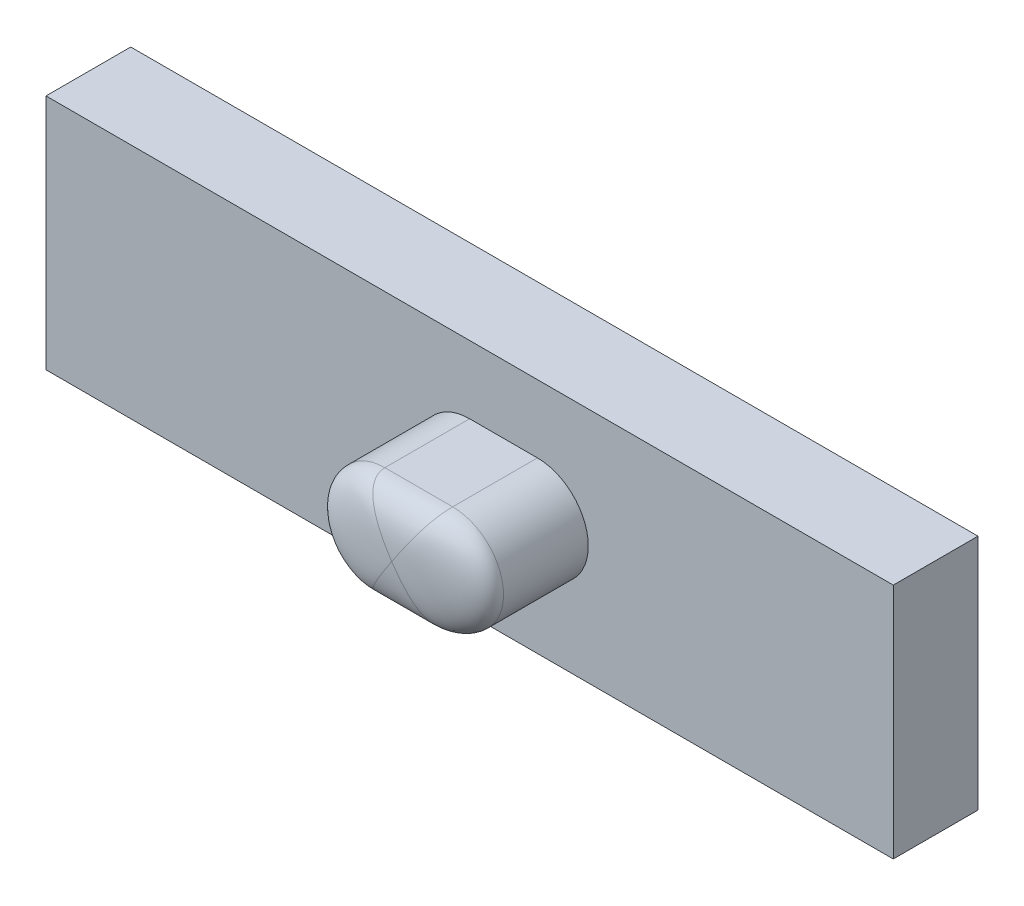
ISO-10303-21;
HEADER;
FILE_DESCRIPTION(('STEP AP214'),'2;1');
FILE_NAME('part.step','',(''),(''),'','','');
FILE_SCHEMA(('AUTOMOTIVE_DESIGN { 1 0 10303 214 1 1 1 1 }'));
ENDSEC;
DATA;
#1=APPLICATION_CONTEXT('core data for automotive mechanical design processes');
#2=APPLICATION_PROTOCOL_DEFINITION('international standard','automotive_design',2000,#1);
#3=PRODUCT_CONTEXT('',#1,'mechanical');
#4=PRODUCT('Part','Part','',(#3));
#5=PRODUCT_RELATED_PRODUCT_CATEGORY('part','',(#4));
#6=PRODUCT_DEFINITION_FORMATION('','',#4);
#7=PRODUCT_DEFINITION_CONTEXT('part definition',#1,'design');
#8=PRODUCT_DEFINITION('design','',#6,#7);
#9=PRODUCT_DEFINITION_SHAPE('','',#8);
#10=(LENGTH_UNIT() NAMED_UNIT(*) SI_UNIT(.MILLI.,.METRE.));
#11=(NAMED_UNIT(*) PLANE_ANGLE_UNIT() SI_UNIT($,.RADIAN.));
#12=(NAMED_UNIT(*) SI_UNIT($,.STERADIAN.) SOLID_ANGLE_UNIT());
#13=UNCERTAINTY_MEASURE_WITH_UNIT(LENGTH_MEASURE(1.E-05),#10,'distance_accuracy_value','');
#14=(GEOMETRIC_REPRESENTATION_CONTEXT(3) GLOBAL_UNCERTAINTY_ASSIGNED_CONTEXT((#13)) GLOBAL_UNIT_ASSIGNED_CONTEXT((#10,
#11,#12)) REPRESENTATION_CONTEXT('',''));
#15=CARTESIAN_POINT('',(0.,0.,0.));
#16=DIRECTION('',(0.,0.,1.));
#17=DIRECTION('',(1.,0.,0.));
#18=AXIS2_PLACEMENT_3D('',#15,#16,#17);
#19=CARTESIAN_POINT('',(0.,0.,0.));
#20=DIRECTION('',(0.,0.,-1.));
#21=DIRECTION('',(-1.,0.,0.));
#22=AXIS2_PLACEMENT_3D('',#19,#20,#21);
#23=PLANE('',#22);
#24=DIRECTION('',(1.,0.,0.));
#25=VECTOR('',#24,1.);
#26=CARTESIAN_POINT('',(-11.5,3.5,0.));
#27=LINE('',#26,#25);
#28=CARTESIAN_POINT('',(-13.5,3.5,0.));
#29=VERTEX_POINT('',#28);
#30=CARTESIAN_POINT('',(11.5,3.5,0.));
#31=VERTEX_POINT('',#30);
#32=EDGE_CURVE('E266',#29,#31,#27,.T.);
#33=ORIENTED_EDGE('',*,*,#32,.F.);
#34=DIRECTION('',(0.,1.,0.));
#35=VECTOR('',#34,1.);
#36=CARTESIAN_POINT('',(-13.5,-3.5,0.));
#37=LINE('',#36,#35);
#38=CARTESIAN_POINT('',(-13.5,-3.5,0.));
#39=VERTEX_POINT('',#38);
#40=EDGE_CURVE('E270',#39,#29,#37,.T.);
#41=ORIENTED_EDGE('',*,*,#40,.F.);
#42=DIRECTION('',(-1.,0.,0.));
#43=VECTOR('',#42,1.);
#44=CARTESIAN_POINT('',(-11.5,-3.50000000000001,0.));
#45=LINE('',#44,#43);
#46=CARTESIAN_POINT('',(11.5,-3.5,0.));
#47=VERTEX_POINT('',#46);
#48=EDGE_CURVE('E282',#47,#39,#45,.T.);
#49=ORIENTED_EDGE('',*,*,#48,.F.);
#50=DIRECTION('',(0.,-1.,0.));
#51=VECTOR('',#50,1.);
#52=CARTESIAN_POINT('',(11.5,3.5,0.));
#53=LINE('',#52,#51);
#54=EDGE_CURVE('E279',#31,#47,#53,.T.);
#55=ORIENTED_EDGE('',*,*,#54,.F.);
#56=EDGE_LOOP('',(#33,#41,#49,#55));
#57=FACE_BOUND('',#56,.T.);
#58=CARTESIAN_POINT('',(-1.,0.,0.));
#59=DIRECTION('',(0.,0.,1.));
#60=DIRECTION('',(1.,0.,0.));
#61=AXIS2_PLACEMENT_3D('',#58,#59,#60);
#62=CIRCLE('',#61,1.5);
#63=CARTESIAN_POINT('',(-1.,1.5,0.));
#64=VERTEX_POINT('',#63);
#65=CARTESIAN_POINT('',(-1.,-1.5,0.));
#66=VERTEX_POINT('',#65);
#67=EDGE_CURVE('E233',#64,#66,#62,.T.);
#68=ORIENTED_EDGE('',*,*,#67,.F.);
#69=DIRECTION('',(1.,0.,0.));
#70=VECTOR('',#69,1.);
#71=CARTESIAN_POINT('',(-1.,1.5,0.));
#72=LINE('',#71,#70);
#73=CARTESIAN_POINT('',(1.,1.5,0.));
#74=VERTEX_POINT('',#73);
#75=EDGE_CURVE('E240',#64,#74,#72,.T.);
#76=ORIENTED_EDGE('',*,*,#75,.T.);
#77=CARTESIAN_POINT('',(1.,0.,0.));
#78=DIRECTION('',(0.,0.,1.));
#79=DIRECTION('',(1.,0.,0.));
#80=AXIS2_PLACEMENT_3D('',#77,#78,#79);
#81=CIRCLE('',#80,1.5);
#82=CARTESIAN_POINT('',(1.,-1.5,0.));
#83=VERTEX_POINT('',#82);
#84=EDGE_CURVE('E253',#83,#74,#81,.T.);
#85=ORIENTED_EDGE('',*,*,#84,.F.);
#86=DIRECTION('',(1.,0.,0.));
#87=VECTOR('',#86,1.);
#88=CARTESIAN_POINT('',(-1.,-1.5,0.));
#89=LINE('',#88,#87);
#90=EDGE_CURVE('E251',#66,#83,#89,.T.);
#91=ORIENTED_EDGE('',*,*,#90,.F.);
#92=EDGE_LOOP('',(#68,#76,#85,#91));
#93=FACE_BOUND('',#92,.T.);
#94=ADVANCED_FACE('F35',(#57,#93),#23,.F.);
#95=CARTESIAN_POINT('',(-11.5,3.5,-2.5));
#96=DIRECTION('',(0.,-1.,0.));
#97=DIRECTION('',(1.,0.,0.));
#98=AXIS2_PLACEMENT_3D('',#95,#96,#97);
#99=PLANE('',#98);
#100=ORIENTED_EDGE('',*,*,#32,.T.);
#101=DIRECTION('',(0.,0.,1.));
#102=VECTOR('',#101,1.);
#103=CARTESIAN_POINT('',(11.5,3.5,-2.5));
#104=LINE('',#103,#102);
#105=CARTESIAN_POINT('',(11.5,3.5,-2.5));
#106=VERTEX_POINT('',#105);
#107=EDGE_CURVE('E294',#106,#31,#104,.T.);
#108=ORIENTED_EDGE('',*,*,#107,.F.);
#109=DIRECTION('',(1.,0.,0.));
#110=VECTOR('',#109,1.);
#111=CARTESIAN_POINT('',(-13.5,3.5,-2.5));
#112=LINE('',#111,#110);
#113=CARTESIAN_POINT('',(-13.5,3.5,-2.5));
#114=VERTEX_POINT('',#113);
#115=EDGE_CURVE('E267',#114,#106,#112,.T.);
#116=ORIENTED_EDGE('',*,*,#115,.F.);
#117=DIRECTION('',(0.,0.,1.));
#118=VECTOR('',#117,1.);
#119=CARTESIAN_POINT('',(-13.5,3.5,-2.5));
#120=LINE('',#119,#118);
#121=EDGE_CURVE('E277',#114,#29,#120,.T.);
#122=ORIENTED_EDGE('',*,*,#121,.T.);
#123=EDGE_LOOP('',(#100,#108,#116,#122));
#124=FACE_BOUND('',#123,.T.);
#125=ADVANCED_FACE('F37',(#124),#99,.F.);
#126=CARTESIAN_POINT('',(11.5,3.5,-2.5));
#127=DIRECTION('',(-1.,0.,0.));
#128=DIRECTION('',(0.,0.,1.));
#129=AXIS2_PLACEMENT_3D('',#126,#127,#128);
#130=PLANE('',#129);
#131=ORIENTED_EDGE('',*,*,#54,.T.);
#132=DIRECTION('',(0.,0.,1.));
#133=VECTOR('',#132,1.);
#134=CARTESIAN_POINT('',(11.5,-3.5,-2.5));
#135=LINE('',#134,#133);
#136=CARTESIAN_POINT('',(11.5,-3.5,-2.5));
#137=VERTEX_POINT('',#136);
#138=EDGE_CURVE('E291',#137,#47,#135,.T.);
#139=ORIENTED_EDGE('',*,*,#138,.F.);
#140=DIRECTION('',(0.,-1.,0.));
#141=VECTOR('',#140,1.);
#142=CARTESIAN_POINT('',(11.5,3.5,-2.5));
#143=LINE('',#142,#141);
#144=EDGE_CURVE('E269',#106,#137,#143,.T.);
#145=ORIENTED_EDGE('',*,*,#144,.F.);
#146=ORIENTED_EDGE('',*,*,#107,.T.);
#147=EDGE_LOOP('',(#131,#139,#145,#146));
#148=FACE_BOUND('',#147,.T.);
#149=ADVANCED_FACE('F343',(#148),#130,.F.);
#150=CARTESIAN_POINT('',(-11.5,-3.50000000000001,-2.5));
#151=DIRECTION('',(0.,1.,0.));
#152=DIRECTION('',(-1.,0.,0.));
#153=AXIS2_PLACEMENT_3D('',#150,#151,#152);
#154=PLANE('',#153);
#155=ORIENTED_EDGE('',*,*,#48,.T.);
#156=DIRECTION('',(0.,0.,1.));
#157=VECTOR('',#156,1.);
#158=CARTESIAN_POINT('',(-13.5,-3.5,-2.5));
#159=LINE('',#158,#157);
#160=CARTESIAN_POINT('',(-13.5,-3.5,-2.5));
#161=VERTEX_POINT('',#160);
#162=EDGE_CURVE('E288',#161,#39,#159,.T.);
#163=ORIENTED_EDGE('',*,*,#162,.F.);
#164=DIRECTION('',(1.,0.,0.));
#165=VECTOR('',#164,1.);
#166=CARTESIAN_POINT('',(-11.5,-3.50000000000001,-2.5));
#167=LINE('',#166,#165);
#168=EDGE_CURVE('E272',#161,#137,#167,.T.);
#169=ORIENTED_EDGE('',*,*,#168,.T.);
#170=ORIENTED_EDGE('',*,*,#138,.T.);
#171=EDGE_LOOP('',(#155,#163,#169,#170));
#172=FACE_BOUND('',#171,.T.);
#173=ADVANCED_FACE('F352',(#172),#154,.F.);
#174=CARTESIAN_POINT('',(-13.5,-3.5,-2.5));
#175=DIRECTION('',(1.,0.,0.));
#176=DIRECTION('',(0.,0.,-1.));
#177=AXIS2_PLACEMENT_3D('',#174,#175,#176);
#178=PLANE('',#177);
#179=ORIENTED_EDGE('',*,*,#40,.T.);
#180=ORIENTED_EDGE('',*,*,#121,.F.);
#181=DIRECTION('',(0.,1.,0.));
#182=VECTOR('',#181,1.);
#183=CARTESIAN_POINT('',(-13.5,-3.5,-2.5));
#184=LINE('',#183,#182);
#185=EDGE_CURVE('E275',#161,#114,#184,.T.);
#186=ORIENTED_EDGE('',*,*,#185,.F.);
#187=ORIENTED_EDGE('',*,*,#162,.T.);
#188=EDGE_LOOP('',(#179,#180,#186,#187));
#189=FACE_BOUND('',#188,.T.);
#190=ADVANCED_FACE('F349',(#189),#178,.F.);
#191=CARTESIAN_POINT('',(0.,0.,-2.5));
#192=DIRECTION('',(0.,0.,-1.));
#193=DIRECTION('',(-1.,0.,0.));
#194=AXIS2_PLACEMENT_3D('',#191,#192,#193);
#195=PLANE('',#194);
#196=DIRECTION('',(0.,1.,0.));
#197=VECTOR('',#196,1.);
#198=CARTESIAN_POINT('',(-4.19059892324151,-3.,-2.5));
#199=LINE('',#198,#197);
#200=CARTESIAN_POINT('',(-4.19059892324151,-3.,-2.5));
#201=VERTEX_POINT('',#200);
#202=CARTESIAN_POINT('',(-4.19059892324151,3.,-2.5));
#203=VERTEX_POINT('',#202);
#204=EDGE_CURVE('E203',#201,#203,#199,.T.);
#205=ORIENTED_EDGE('',*,*,#204,.F.);
#206=DIRECTION('',(1.,0.,0.));
#207=VECTOR('',#206,1.);
#208=CARTESIAN_POINT('',(0.,-3.,-2.5));
#209=LINE('',#208,#207);
#210=CARTESIAN_POINT('',(4.38675134594811,-3.,-2.5));
#211=VERTEX_POINT('',#210);
#212=EDGE_CURVE('E39',#201,#211,#209,.T.);
#213=ORIENTED_EDGE('',*,*,#212,.T.);
#214=DIRECTION('',(0.,-1.,0.));
#215=VECTOR('',#214,1.);
#216=CARTESIAN_POINT('',(4.38675134594811,0.,-2.5));
#217=LINE('',#216,#215);
#218=CARTESIAN_POINT('',(4.38675134594811,3.,-2.5));
#219=VERTEX_POINT('',#218);
#220=EDGE_CURVE('E300',#219,#211,#217,.T.);
#221=ORIENTED_EDGE('',*,*,#220,.F.);
#222=DIRECTION('',(1.,0.,0.));
#223=VECTOR('',#222,1.);
#224=CARTESIAN_POINT('',(0.,3.,-2.5));
#225=LINE('',#224,#223);
#226=EDGE_CURVE('E297',#203,#219,#225,.T.);
#227=ORIENTED_EDGE('',*,*,#226,.F.);
#228=EDGE_LOOP('',(#205,#213,#221,#227));
#229=FACE_BOUND('',#228,.T.);
#230=CARTESIAN_POINT('',(-11.5,-3.,-2.5));
#231=VERTEX_POINT('',#230);
#232=CARTESIAN_POINT('',(-5.19059892324151,-3.,-2.5));
#233=VERTEX_POINT('',#232);
#234=EDGE_CURVE('E11',#231,#233,#209,.T.);
#235=ORIENTED_EDGE('',*,*,#234,.T.);
#236=DIRECTION('',(0.,1.,0.));
#237=VECTOR('',#236,1.);
#238=CARTESIAN_POINT('',(-5.19059892324151,-3.,-2.5));
#239=LINE('',#238,#237);
#240=CARTESIAN_POINT('',(-5.19059892324151,3.,-2.5));
#241=VERTEX_POINT('',#240);
#242=EDGE_CURVE('E161',#233,#241,#239,.T.);
#243=ORIENTED_EDGE('',*,*,#242,.T.);
#244=CARTESIAN_POINT('',(-11.5,3.,-2.5));
#245=VERTEX_POINT('',#244);
#246=EDGE_CURVE('E299',#245,#241,#225,.T.);
#247=ORIENTED_EDGE('',*,*,#246,.F.);
#248=DIRECTION('',(0.,1.,0.));
#249=VECTOR('',#248,1.);
#250=CARTESIAN_POINT('',(-11.5,0.,-2.5));
#251=LINE('',#250,#249);
#252=EDGE_CURVE('E301',#231,#245,#251,.T.);
#253=ORIENTED_EDGE('',*,*,#252,.F.);
#254=EDGE_LOOP('',(#235,#243,#247,#253));
#255=FACE_BOUND('',#254,.T.);
#256=ORIENTED_EDGE('',*,*,#115,.T.);
#257=ORIENTED_EDGE('',*,*,#144,.T.);
#258=ORIENTED_EDGE('',*,*,#168,.F.);
#259=ORIENTED_EDGE('',*,*,#185,.T.);
#260=EDGE_LOOP('',(#256,#257,#258,#259));
#261=FACE_BOUND('',#260,.T.);
#262=ADVANCED_FACE('F309',(#229,#255,#261),#195,.T.);
#263=CARTESIAN_POINT('',(-1.,0.,2.5));
#264=DIRECTION('',(0.,0.,-1.));
#265=DIRECTION('',(-1.,0.,0.));
#266=AXIS2_PLACEMENT_3D('',#263,#264,#265);
#267=CYLINDRICAL_SURFACE('',#266,1.5);
#268=ORIENTED_EDGE('',*,*,#67,.T.);
#269=DIRECTION('',(0.,0.,-1.));
#270=VECTOR('',#269,1.);
#271=CARTESIAN_POINT('',(-1.,-1.5,2.5));
#272=LINE('',#271,#270);
#273=CARTESIAN_POINT('',(-1.,-1.5,2.5));
#274=VERTEX_POINT('',#273);
#275=EDGE_CURVE('E264',#274,#66,#272,.T.);
#276=ORIENTED_EDGE('',*,*,#275,.F.);
#277=CARTESIAN_POINT('',(-1.,0.,2.5));
#278=DIRECTION('',(0.,0.,1.));
#279=DIRECTION('',(1.,0.,0.));
#280=AXIS2_PLACEMENT_3D('',#277,#278,#279);
#281=CIRCLE('',#280,1.5);
#282=CARTESIAN_POINT('',(-1.,1.5,2.5));
#283=VERTEX_POINT('',#282);
#284=EDGE_CURVE('E234',#283,#274,#281,.T.);
#285=ORIENTED_EDGE('',*,*,#284,.F.);
#286=DIRECTION('',(0.,0.,-1.));
#287=VECTOR('',#286,1.);
#288=CARTESIAN_POINT('',(-1.,1.5,2.5));
#289=LINE('',#288,#287);
#290=EDGE_CURVE('E248',#283,#64,#289,.T.);
#291=ORIENTED_EDGE('',*,*,#290,.T.);
#292=EDGE_LOOP('',(#268,#276,#285,#291));
#293=FACE_BOUND('',#292,.T.);
#294=ADVANCED_FACE('F371',(#293),#267,.T.);
#295=CARTESIAN_POINT('',(-1.,-1.5,2.5));
#296=DIRECTION('',(0.,1.,0.));
#297=DIRECTION('',(0.,0.,1.));
#298=AXIS2_PLACEMENT_3D('',#295,#296,#297);
#299=PLANE('',#298);
#300=ORIENTED_EDGE('',*,*,#90,.T.);
#301=DIRECTION('',(0.,0.,-1.));
#302=VECTOR('',#301,1.);
#303=CARTESIAN_POINT('',(1.,-1.5,2.5));
#304=LINE('',#303,#302);
#305=CARTESIAN_POINT('',(1.,-1.5,2.5));
#306=VERTEX_POINT('',#305);
#307=EDGE_CURVE('E261',#306,#83,#304,.T.);
#308=ORIENTED_EDGE('',*,*,#307,.F.);
#309=DIRECTION('',(1.,0.,0.));
#310=VECTOR('',#309,1.);
#311=CARTESIAN_POINT('',(-1.,-1.5,2.5));
#312=LINE('',#311,#310);
#313=EDGE_CURVE('E239',#274,#306,#312,.T.);
#314=ORIENTED_EDGE('',*,*,#313,.F.);
#315=ORIENTED_EDGE('',*,*,#275,.T.);
#316=EDGE_LOOP('',(#300,#308,#314,#315));
#317=FACE_BOUND('',#316,.T.);
#318=ADVANCED_FACE('F375',(#317),#299,.F.);
#319=CARTESIAN_POINT('',(1.,0.,2.5));
#320=DIRECTION('',(0.,0.,-1.));
#321=DIRECTION('',(-1.,0.,0.));
#322=AXIS2_PLACEMENT_3D('',#319,#320,#321);
#323=CYLINDRICAL_SURFACE('',#322,1.5);
#324=ORIENTED_EDGE('',*,*,#84,.T.);
#325=DIRECTION('',(0.,0.,-1.));
#326=VECTOR('',#325,1.);
#327=CARTESIAN_POINT('',(1.,1.5,2.5));
#328=LINE('',#327,#326);
#329=CARTESIAN_POINT('',(1.,1.5,2.5));
#330=VERTEX_POINT('',#329);
#331=EDGE_CURVE('E258',#330,#74,#328,.T.);
#332=ORIENTED_EDGE('',*,*,#331,.F.);
#333=CARTESIAN_POINT('',(1.,0.,2.5));
#334=DIRECTION('',(0.,0.,1.));
#335=DIRECTION('',(1.,0.,0.));
#336=AXIS2_PLACEMENT_3D('',#333,#334,#335);
#337=CIRCLE('',#336,1.5);
#338=EDGE_CURVE('E242',#306,#330,#337,.T.);
#339=ORIENTED_EDGE('',*,*,#338,.F.);
#340=ORIENTED_EDGE('',*,*,#307,.T.);
#341=EDGE_LOOP('',(#324,#332,#339,#340));
#342=FACE_BOUND('',#341,.T.);
#343=ADVANCED_FACE('F380',(#342),#323,.T.);
#344=CARTESIAN_POINT('',(-1.,1.5,2.5));
#345=DIRECTION('',(0.,1.,0.));
#346=DIRECTION('',(0.,0.,1.));
#347=AXIS2_PLACEMENT_3D('',#344,#345,#346);
#348=PLANE('',#347);
#349=ORIENTED_EDGE('',*,*,#75,.F.);
#350=ORIENTED_EDGE('',*,*,#290,.F.);
#351=DIRECTION('',(1.,0.,0.));
#352=VECTOR('',#351,1.);
#353=CARTESIAN_POINT('',(-1.,1.5,2.5));
#354=LINE('',#353,#352);
#355=EDGE_CURVE('E245',#283,#330,#354,.T.);
#356=ORIENTED_EDGE('',*,*,#355,.T.);
#357=ORIENTED_EDGE('',*,*,#331,.T.);
#358=EDGE_LOOP('',(#349,#350,#356,#357));
#359=FACE_BOUND('',#358,.T.);
#360=ADVANCED_FACE('F386',(#359),#348,.T.);
#361=CARTESIAN_POINT('',(-1.,1.5,2.5));
#362=CARTESIAN_POINT('',(-1.,1.5,3.3));
#363=CARTESIAN_POINT('',(0.,0.,3.3));
#364=CARTESIAN_POINT('',(-4.,1.5,2.5));
#365=CARTESIAN_POINT('',(-4.,1.5,3.3));
#366=CARTESIAN_POINT('',(0.,0.,3.3));
#367=CARTESIAN_POINT('',(-4.,-1.5,2.5));
#368=CARTESIAN_POINT('',(-4.,-1.5,3.3));
#369=CARTESIAN_POINT('',(0.,0.,3.3));
#370=CARTESIAN_POINT('',(-1.,-1.5,2.5));
#371=CARTESIAN_POINT('',(-1.,-1.5,3.3));
#372=CARTESIAN_POINT('',(0.,0.,3.3));
#373=(BOUNDED_SURFACE() B_SPLINE_SURFACE(3,2,((#361,#362,#363),(#364,#365,#366),(#367,#368,
#369),(#370,#371,#372)),.UNSPECIFIED.,.F.,.F.,.F.) B_SPLINE_SURFACE_WITH_KNOTS((4,4),(3,3),(0.,
1.),(0.,1.),.UNSPECIFIED.) GEOMETRIC_REPRESENTATION_ITEM() RATIONAL_B_SPLINE_SURFACE(((1.,1.,
1.),(0.333333333333333,0.333333333333333,0.333333333333333),(0.333333333333333,
0.333333333333333,0.333333333333333),(1.,1.,1.))) REPRESENTATION_ITEM('') SURFACE());
#374=CARTESIAN_POINT('',(-1.,-1.5,2.5));
#375=CARTESIAN_POINT('',(-1.,-1.5,3.3));
#376=CARTESIAN_POINT('',(0.,0.,3.3));
#377=(BOUNDED_CURVE() B_SPLINE_CURVE(2,(#374,#375,#376),.UNSPECIFIED.,.F.,
.F.) B_SPLINE_CURVE_WITH_KNOTS((3,3),(0.,1.),
.UNSPECIFIED.) CURVE() GEOMETRIC_REPRESENTATION_ITEM() RATIONAL_B_SPLINE_CURVE((1.,1.,1.)) REPRESENTATION_ITEM(''));
#378=CARTESIAN_POINT('',(0.,0.,3.3));
#379=VERTEX_POINT('',#378);
#380=EDGE_CURVE('E206',#274,#379,#377,.T.);
#381=CARTESIAN_POINT('',(-1.,1.5,2.5));
#382=CARTESIAN_POINT('',(-1.,1.5,3.3));
#383=CARTESIAN_POINT('',(0.,0.,3.3));
#384=(BOUNDED_CURVE() B_SPLINE_CURVE(2,(#381,#382,#383),.UNSPECIFIED.,.F.,
.F.) B_SPLINE_CURVE_WITH_KNOTS((3,3),(0.,1.),
.UNSPECIFIED.) CURVE() GEOMETRIC_REPRESENTATION_ITEM() RATIONAL_B_SPLINE_CURVE((1.,1.,1.)) REPRESENTATION_ITEM(''));
#385=EDGE_CURVE('E197',#379,#283,#384,.F.);
#386=ORIENTED_EDGE('',*,*,#284,.T.);
#387=ORIENTED_EDGE('',*,*,#380,.T.);
#388=ORIENTED_EDGE('',*,*,#385,.T.);
#389=EDGE_LOOP('',(#386,#387,#388));
#390=FACE_BOUND('',#389,.T.);
#391=ADVANCED_FACE('F390',(#390),#373,.T.);
#392=CARTESIAN_POINT('',(-1.,-1.5,2.5));
#393=CARTESIAN_POINT('',(-1.,-1.5,3.3));
#394=CARTESIAN_POINT('',(0.,0.,3.3));
#395=CARTESIAN_POINT('',(1.,-1.5,2.5));
#396=CARTESIAN_POINT('',(1.,-1.5,3.3));
#397=CARTESIAN_POINT('',(0.,0.,3.3));
#398=(BOUNDED_SURFACE() B_SPLINE_SURFACE(1,2,((#392,#393,#394),(#395,#396,#397)),.UNSPECIFIED.,
.F.,.F.,.F.) B_SPLINE_SURFACE_WITH_KNOTS((2,2),(3,3),(0.,1.),(0.,1.),
.UNSPECIFIED.) GEOMETRIC_REPRESENTATION_ITEM() RATIONAL_B_SPLINE_SURFACE(((1.,1.,1.),(1.,1.,1.))) REPRESENTATION_ITEM('') SURFACE());
#399=CARTESIAN_POINT('',(1.,-1.5,2.5));
#400=CARTESIAN_POINT('',(1.,-1.5,3.3));
#401=CARTESIAN_POINT('',(0.,0.,3.3));
#402=(BOUNDED_CURVE() B_SPLINE_CURVE(2,(#399,#400,#401),.UNSPECIFIED.,.F.,
.F.) B_SPLINE_CURVE_WITH_KNOTS((3,3),(0.,1.),
.UNSPECIFIED.) CURVE() GEOMETRIC_REPRESENTATION_ITEM() RATIONAL_B_SPLINE_CURVE((1.,1.,1.)) REPRESENTATION_ITEM(''));
#403=EDGE_CURVE('E211',#306,#379,#402,.T.);
#404=ORIENTED_EDGE('',*,*,#313,.T.);
#405=ORIENTED_EDGE('',*,*,#403,.T.);
#406=ORIENTED_EDGE('',*,*,#380,.F.);
#407=EDGE_LOOP('',(#404,#405,#406));
#408=FACE_BOUND('',#407,.T.);
#409=ADVANCED_FACE('F408',(#408),#398,.T.);
#410=CARTESIAN_POINT('',(1.,1.5,2.5));
#411=CARTESIAN_POINT('',(1.,1.5,3.3));
#412=CARTESIAN_POINT('',(0.,0.,3.3));
#413=CARTESIAN_POINT('',(-1.,1.5,2.5));
#414=CARTESIAN_POINT('',(-1.,1.5,3.3));
#415=CARTESIAN_POINT('',(0.,0.,3.3));
#416=(BOUNDED_SURFACE() B_SPLINE_SURFACE(1,2,((#410,#411,#412),(#413,#414,#415)),.UNSPECIFIED.,
.F.,.F.,.F.) B_SPLINE_SURFACE_WITH_KNOTS((2,2),(3,3),(0.,1.),(0.,1.),
.UNSPECIFIED.) GEOMETRIC_REPRESENTATION_ITEM() RATIONAL_B_SPLINE_SURFACE(((1.,1.,1.),(1.,1.,1.))) REPRESENTATION_ITEM('') SURFACE());
#417=CARTESIAN_POINT('',(1.,1.5,2.5));
#418=CARTESIAN_POINT('',(1.,1.5,3.3));
#419=CARTESIAN_POINT('',(0.,0.,3.3));
#420=(BOUNDED_CURVE() B_SPLINE_CURVE(2,(#417,#418,#419),.UNSPECIFIED.,.F.,
.F.) B_SPLINE_CURVE_WITH_KNOTS((3,3),(0.,1.),
.UNSPECIFIED.) CURVE() GEOMETRIC_REPRESENTATION_ITEM() RATIONAL_B_SPLINE_CURVE((1.,1.,1.)) REPRESENTATION_ITEM(''));
#421=EDGE_CURVE('E225',#330,#379,#420,.T.);
#422=ORIENTED_EDGE('',*,*,#355,.F.);
#423=ORIENTED_EDGE('',*,*,#385,.F.);
#424=ORIENTED_EDGE('',*,*,#421,.F.);
#425=EDGE_LOOP('',(#422,#423,#424));
#426=FACE_BOUND('',#425,.T.);
#427=ADVANCED_FACE('F397',(#426),#416,.T.);
#428=CARTESIAN_POINT('',(1.,-1.5,2.5));
#429=CARTESIAN_POINT('',(1.,-1.5,3.3));
#430=CARTESIAN_POINT('',(0.,0.,3.3));
#431=CARTESIAN_POINT('',(4.,-1.5,2.5));
#432=CARTESIAN_POINT('',(4.,-1.5,3.3));
#433=CARTESIAN_POINT('',(0.,0.,3.3));
#434=CARTESIAN_POINT('',(4.,1.5,2.5));
#435=CARTESIAN_POINT('',(4.,1.5,3.3));
#436=CARTESIAN_POINT('',(0.,0.,3.3));
#437=CARTESIAN_POINT('',(1.,1.5,2.5));
#438=CARTESIAN_POINT('',(1.,1.5,3.3));
#439=CARTESIAN_POINT('',(0.,0.,3.3));
#440=(BOUNDED_SURFACE() B_SPLINE_SURFACE(3,2,((#428,#429,#430),(#431,#432,#433),(#434,#435,
#436),(#437,#438,#439)),.UNSPECIFIED.,.F.,.F.,.F.) B_SPLINE_SURFACE_WITH_KNOTS((4,4),(3,3),(0.,
1.),(0.,1.),.UNSPECIFIED.) GEOMETRIC_REPRESENTATION_ITEM() RATIONAL_B_SPLINE_SURFACE(((1.,1.,
1.),(0.333333333333333,0.333333333333333,0.333333333333333),(0.333333333333333,
0.333333333333333,0.333333333333333),(1.,1.,1.))) REPRESENTATION_ITEM('') SURFACE());
#441=ORIENTED_EDGE('',*,*,#338,.T.);
#442=ORIENTED_EDGE('',*,*,#421,.T.);
#443=ORIENTED_EDGE('',*,*,#403,.F.);
#444=EDGE_LOOP('',(#441,#442,#443));
#445=FACE_BOUND('',#444,.T.);
#446=ADVANCED_FACE('F392',(#445),#440,.T.);
#447=CARTESIAN_POINT('',(1.83012701892217,-3.,-2.));
#448=DIRECTION('',(0.,0.,1.));
#449=DIRECTION('',(1.,0.,0.));
#450=AXIS2_PLACEMENT_3D('',#447,#448,#449);
#451=PLANE('',#450);
#452=DIRECTION('',(1.,0.,0.));
#453=VECTOR('',#452,1.);
#454=CARTESIAN_POINT('',(1.83012701892217,3.,-2.));
#455=LINE('',#454,#453);
#456=CARTESIAN_POINT('',(-3.9019237886467,3.,-2.));
#457=VERTEX_POINT('',#456);
#458=CARTESIAN_POINT('',(4.0980762113533,3.,-2.));
#459=VERTEX_POINT('',#458);
#460=EDGE_CURVE('E190',#457,#459,#455,.T.);
#461=ORIENTED_EDGE('',*,*,#460,.T.);
#462=DIRECTION('',(0.,1.,0.));
#463=VECTOR('',#462,1.);
#464=CARTESIAN_POINT('',(4.0980762113533,-3.,-2.));
#465=LINE('',#464,#463);
#466=CARTESIAN_POINT('',(4.0980762113533,-3.,-2.));
#467=VERTEX_POINT('',#466);
#468=EDGE_CURVE('E198',#467,#459,#465,.T.);
#469=ORIENTED_EDGE('',*,*,#468,.F.);
#470=DIRECTION('',(1.,0.,0.));
#471=VECTOR('',#470,1.);
#472=CARTESIAN_POINT('',(-3.9019237886467,-3.,-2.));
#473=LINE('',#472,#471);
#474=CARTESIAN_POINT('',(-3.9019237886467,-3.,-2.));
#475=VERTEX_POINT('',#474);
#476=EDGE_CURVE('E180',#475,#467,#473,.T.);
#477=ORIENTED_EDGE('',*,*,#476,.F.);
#478=DIRECTION('',(0.,1.,0.));
#479=VECTOR('',#478,1.);
#480=CARTESIAN_POINT('',(-3.9019237886467,-3.,-2.));
#481=LINE('',#480,#479);
#482=EDGE_CURVE('E200',#475,#457,#481,.T.);
#483=ORIENTED_EDGE('',*,*,#482,.T.);
#484=EDGE_LOOP('',(#461,#469,#477,#483));
#485=FACE_BOUND('',#484,.T.);
#486=ADVANCED_FACE('F321',(#485),#451,.F.);
#487=CARTESIAN_POINT('',(0.,-3.,0.));
#488=DIRECTION('',(0.,1.,0.));
#489=DIRECTION('',(0.,0.,1.));
#490=AXIS2_PLACEMENT_3D('',#487,#488,#489);
#491=PLANE('',#490);
#492=DIRECTION('',(0.5,0.,0.866025403784438));
#493=VECTOR('',#492,1.);
#494=CARTESIAN_POINT('',(-4.19059892324151,-3.,-2.5));
#495=LINE('',#494,#493);
#496=EDGE_CURVE('E169',#201,#475,#495,.T.);
#497=ORIENTED_EDGE('',*,*,#496,.T.);
#498=ORIENTED_EDGE('',*,*,#476,.T.);
#499=DIRECTION('',(0.499999999999994,0.,-0.866025403784442));
#500=VECTOR('',#499,1.);
#501=CARTESIAN_POINT('',(4.0980762113533,-3.,-2.));
#502=LINE('',#501,#500);
#503=EDGE_CURVE('E182',#467,#211,#502,.T.);
#504=ORIENTED_EDGE('',*,*,#503,.T.);
#505=ORIENTED_EDGE('',*,*,#212,.F.);
#506=EDGE_LOOP('',(#497,#498,#504,#505));
#507=FACE_BOUND('',#506,.T.);
#508=ADVANCED_FACE('F314',(#507),#491,.T.);
#509=CARTESIAN_POINT('',(0.,3.,0.));
#510=DIRECTION('',(0.,1.,0.));
#511=DIRECTION('',(0.,0.,1.));
#512=AXIS2_PLACEMENT_3D('',#509,#510,#511);
#513=PLANE('',#512);
#514=ORIENTED_EDGE('',*,*,#226,.T.);
#515=DIRECTION('',(0.499999999999994,0.,-0.866025403784442));
#516=VECTOR('',#515,1.);
#517=CARTESIAN_POINT('',(4.0980762113533,3.,-2.));
#518=LINE('',#517,#516);
#519=EDGE_CURVE('E175',#459,#219,#518,.T.);
#520=ORIENTED_EDGE('',*,*,#519,.F.);
#521=ORIENTED_EDGE('',*,*,#460,.F.);
#522=DIRECTION('',(0.5,0.,0.866025403784438));
#523=VECTOR('',#522,1.);
#524=CARTESIAN_POINT('',(-4.19059892324151,3.,-2.5));
#525=LINE('',#524,#523);
#526=EDGE_CURVE('E58',#203,#457,#525,.T.);
#527=ORIENTED_EDGE('',*,*,#526,.F.);
#528=EDGE_LOOP('',(#514,#520,#521,#527));
#529=FACE_BOUND('',#528,.T.);
#530=ADVANCED_FACE('F325',(#529),#513,.F.);
#531=CARTESIAN_POINT('',(-4.19059892324151,-3.,-2.5));
#532=DIRECTION('',(-0.866025403784438,0.,0.5));
#533=DIRECTION('',(0.5,0.,0.866025403784439));
#534=AXIS2_PLACEMENT_3D('',#531,#532,#533);
#535=PLANE('',#534);
#536=ORIENTED_EDGE('',*,*,#526,.T.);
#537=ORIENTED_EDGE('',*,*,#482,.F.);
#538=ORIENTED_EDGE('',*,*,#496,.F.);
#539=ORIENTED_EDGE('',*,*,#204,.T.);
#540=EDGE_LOOP('',(#536,#537,#538,#539));
#541=FACE_BOUND('',#540,.T.);
#542=ADVANCED_FACE('F317',(#541),#535,.F.);
#543=CARTESIAN_POINT('',(4.0980762113533,-3.,-2.));
#544=DIRECTION('',(0.866025403784442,0.,0.499999999999994));
#545=DIRECTION('',(0.499999999999994,0.,-0.866025403784442));
#546=AXIS2_PLACEMENT_3D('',#543,#544,#545);
#547=PLANE('',#546);
#548=ORIENTED_EDGE('',*,*,#220,.T.);
#549=ORIENTED_EDGE('',*,*,#503,.F.);
#550=ORIENTED_EDGE('',*,*,#468,.T.);
#551=ORIENTED_EDGE('',*,*,#519,.T.);
#552=EDGE_LOOP('',(#548,#549,#550,#551));
#553=FACE_BOUND('',#552,.T.);
#554=ADVANCED_FACE('F324',(#553),#547,.F.);
#555=DIRECTION('',(0.499999999999994,0.,0.866025403784442));
#556=VECTOR('',#555,1.);
#557=CARTESIAN_POINT('',(-12.6547005383792,-3.,-4.5));
#558=LINE('',#557,#556);
#559=CARTESIAN_POINT('',(-10.3452994616208,-3.,-0.5));
#560=VERTEX_POINT('',#559);
#561=EDGE_CURVE('E162',#231,#560,#558,.T.);
#562=ORIENTED_EDGE('',*,*,#561,.T.);
#563=DIRECTION('',(1.,0.,0.));
#564=VECTOR('',#563,1.);
#565=CARTESIAN_POINT('',(-10.3452994616208,-3.,-0.5));
#566=LINE('',#565,#564);
#567=CARTESIAN_POINT('',(-6.34529946162077,-3.,-0.5));
#568=VERTEX_POINT('',#567);
#569=EDGE_CURVE('E156',#560,#568,#566,.T.);
#570=ORIENTED_EDGE('',*,*,#569,.T.);
#571=DIRECTION('',(0.500000000000001,0.,-0.866025403784438));
#572=VECTOR('',#571,1.);
#573=CARTESIAN_POINT('',(-6.34529946162077,-3.,-0.5));
#574=LINE('',#573,#572);
#575=EDGE_CURVE('E165',#568,#233,#574,.T.);
#576=ORIENTED_EDGE('',*,*,#575,.T.);
#577=ORIENTED_EDGE('',*,*,#234,.F.);
#578=EDGE_LOOP('',(#562,#570,#576,#577));
#579=FACE_BOUND('',#578,.T.);
#580=ADVANCED_FACE('F171',(#579),#491,.T.);
#581=ORIENTED_EDGE('',*,*,#246,.T.);
#582=DIRECTION('',(0.500000000000001,0.,-0.866025403784438));
#583=VECTOR('',#582,1.);
#584=CARTESIAN_POINT('',(-6.34529946162077,3.,-0.5));
#585=LINE('',#584,#583);
#586=CARTESIAN_POINT('',(-6.34529946162077,3.,-0.5));
#587=VERTEX_POINT('',#586);
#588=EDGE_CURVE('E187',#587,#241,#585,.T.);
#589=ORIENTED_EDGE('',*,*,#588,.F.);
#590=DIRECTION('',(1.,0.,0.));
#591=VECTOR('',#590,1.);
#592=CARTESIAN_POINT('',(-10.3452994616208,3.,-0.5));
#593=LINE('',#592,#591);
#594=CARTESIAN_POINT('',(-10.3452994616208,3.,-0.5));
#595=VERTEX_POINT('',#594);
#596=EDGE_CURVE('E157',#595,#587,#593,.T.);
#597=ORIENTED_EDGE('',*,*,#596,.F.);
#598=DIRECTION('',(0.499999999999994,0.,0.866025403784442));
#599=VECTOR('',#598,1.);
#600=CARTESIAN_POINT('',(-12.6547005383792,3.,-4.5));
#601=LINE('',#600,#599);
#602=EDGE_CURVE('E50',#245,#595,#601,.T.);
#603=ORIENTED_EDGE('',*,*,#602,.F.);
#604=EDGE_LOOP('',(#581,#589,#597,#603));
#605=FACE_BOUND('',#604,.T.);
#606=ADVANCED_FACE('F328',(#605),#513,.F.);
#607=CARTESIAN_POINT('',(-10.3452994616208,-3.,-0.5));
#608=DIRECTION('',(0.,0.,1.));
#609=DIRECTION('',(1.,0.,0.));
#610=AXIS2_PLACEMENT_3D('',#607,#608,#609);
#611=PLANE('',#610);
#612=ORIENTED_EDGE('',*,*,#596,.T.);
#613=DIRECTION('',(0.,1.,0.));
#614=VECTOR('',#613,1.);
#615=CARTESIAN_POINT('',(-6.34529946162077,-3.,-0.5));
#616=LINE('',#615,#614);
#617=EDGE_CURVE('E151',#568,#587,#616,.T.);
#618=ORIENTED_EDGE('',*,*,#617,.F.);
#619=ORIENTED_EDGE('',*,*,#569,.F.);
#620=DIRECTION('',(0.,1.,0.));
#621=VECTOR('',#620,1.);
#622=CARTESIAN_POINT('',(-10.3452994616208,-3.,-0.5));
#623=LINE('',#622,#621);
#624=EDGE_CURVE('E195',#560,#595,#623,.T.);
#625=ORIENTED_EDGE('',*,*,#624,.T.);
#626=EDGE_LOOP('',(#612,#618,#619,#625));
#627=FACE_BOUND('',#626,.T.);
#628=ADVANCED_FACE('F153',(#627),#611,.F.);
#629=CARTESIAN_POINT('',(-12.6547005383792,-3.,-4.5));
#630=DIRECTION('',(-0.866025403784442,0.,0.499999999999994));
#631=DIRECTION('',(0.499999999999994,0.,0.866025403784442));
#632=AXIS2_PLACEMENT_3D('',#629,#630,#631);
#633=PLANE('',#632);
#634=ORIENTED_EDGE('',*,*,#252,.T.);
#635=ORIENTED_EDGE('',*,*,#602,.T.);
#636=ORIENTED_EDGE('',*,*,#624,.F.);
#637=ORIENTED_EDGE('',*,*,#561,.F.);
#638=EDGE_LOOP('',(#634,#635,#636,#637));
#639=FACE_BOUND('',#638,.T.);
#640=ADVANCED_FACE('F437',(#639),#633,.F.);
#641=CARTESIAN_POINT('',(-6.34529946162077,-3.,-0.5));
#642=DIRECTION('',(0.866025403784438,0.,0.500000000000001));
#643=DIRECTION('',(0.500000000000001,0.,-0.866025403784438));
#644=AXIS2_PLACEMENT_3D('',#641,#642,#643);
#645=PLANE('',#644);
#646=ORIENTED_EDGE('',*,*,#588,.T.);
#647=ORIENTED_EDGE('',*,*,#242,.F.);
#648=ORIENTED_EDGE('',*,*,#575,.F.);
#649=ORIENTED_EDGE('',*,*,#617,.T.);
#650=EDGE_LOOP('',(#646,#647,#648,#649));
#651=FACE_BOUND('',#650,.T.);
#652=ADVANCED_FACE('F166',(#651),#645,.F.);
#653=CLOSED_SHELL('',(#94,#125,#149,#173,#190,#262,#294,#318,#343,#360,#391,#409,#427,#446,#486,
#508,#530,#542,#554,#580,#606,#628,#640,#652));
#654=MANIFOLD_SOLID_BREP('B2',#653);
#655=ADVANCED_BREP_SHAPE_REPRESENTATION('',(#18,#654),#14);
#656=SHAPE_DEFINITION_REPRESENTATION(#9,#655);
ENDSEC;
END-ISO-10303-21;
